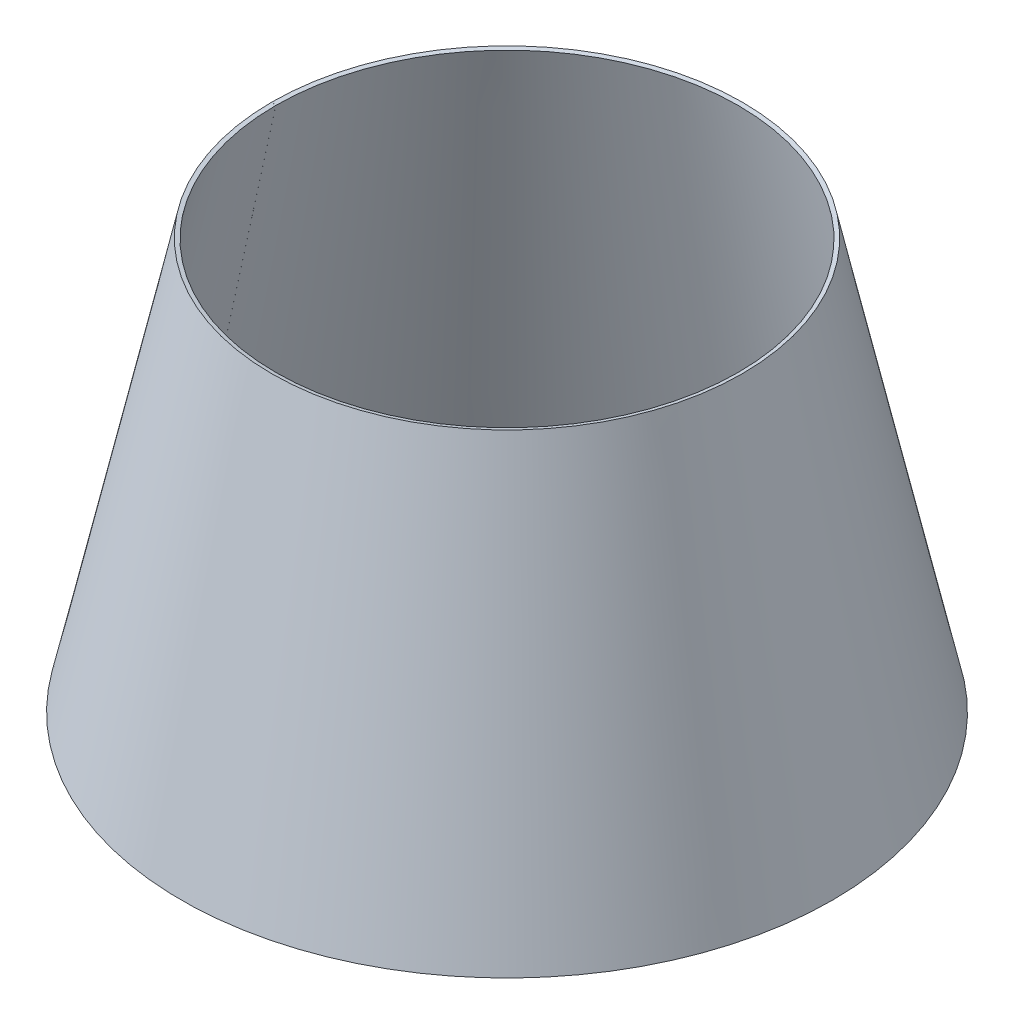
ISO-10303-21;
HEADER;
FILE_DESCRIPTION(('STEP AP214'),'2;1');
FILE_NAME('part.step','',(''),(''),'','','');
FILE_SCHEMA(('AUTOMOTIVE_DESIGN { 1 0 10303 214 1 1 1 1 }'));
ENDSEC;
DATA;
#1=APPLICATION_CONTEXT('core data for automotive mechanical design processes');
#2=APPLICATION_PROTOCOL_DEFINITION('international standard','automotive_design',2000,#1);
#3=PRODUCT_CONTEXT('',#1,'mechanical');
#4=PRODUCT('Part','Part','',(#3));
#5=PRODUCT_RELATED_PRODUCT_CATEGORY('part','',(#4));
#6=PRODUCT_DEFINITION_FORMATION('','',#4);
#7=PRODUCT_DEFINITION_CONTEXT('part definition',#1,'design');
#8=PRODUCT_DEFINITION('design','',#6,#7);
#9=PRODUCT_DEFINITION_SHAPE('','',#8);
#10=(LENGTH_UNIT() NAMED_UNIT(*) SI_UNIT(.MILLI.,.METRE.));
#11=(NAMED_UNIT(*) PLANE_ANGLE_UNIT() SI_UNIT($,.RADIAN.));
#12=(NAMED_UNIT(*) SI_UNIT($,.STERADIAN.) SOLID_ANGLE_UNIT());
#13=UNCERTAINTY_MEASURE_WITH_UNIT(LENGTH_MEASURE(1.E-05),#10,'distance_accuracy_value','');
#14=(GEOMETRIC_REPRESENTATION_CONTEXT(3) GLOBAL_UNCERTAINTY_ASSIGNED_CONTEXT((#13)) GLOBAL_UNIT_ASSIGNED_CONTEXT((#10,
#11,#12)) REPRESENTATION_CONTEXT('',''));
#15=CARTESIAN_POINT('',(0.,0.,0.));
#16=DIRECTION('',(0.,0.,1.));
#17=DIRECTION('',(1.,0.,0.));
#18=AXIS2_PLACEMENT_3D('',#15,#16,#17);
#19=CARTESIAN_POINT('',(0.,0.0927642969351279,0.));
#20=DIRECTION('',(0.,1.,0.));
#21=DIRECTION('',(0.,0.,1.));
#22=AXIS2_PLACEMENT_3D('',#19,#20,#21);
#23=CONICAL_SURFACE('',#22,34.2853179450938,1.35427689759338);
#24=CARTESIAN_POINT('',(0.,0.0927642969351279,0.));
#25=DIRECTION('',(0.,-1.,0.));
#26=DIRECTION('',(0.,0.,-1.));
#27=AXIS2_PLACEMENT_3D('',#24,#25,#26);
#28=CIRCLE('',#27,34.2853179450938);
#29=CARTESIAN_POINT('',(-34.2853174228985,0.0927642969351279,-0.00598391680149054));
#30=VERTEX_POINT('',#29);
#31=CARTESIAN_POINT('',(-34.2853179450938,0.0927642969351279,0.));
#32=VERTEX_POINT('',#31);
#33=EDGE_CURVE('E70',#30,#32,#28,.T.);
#34=ORIENTED_EDGE('',*,*,#33,.T.);
#35=DIRECTION('',(0.976651100263531,-0.214831627918315,0.));
#36=VECTOR('',#35,1.);
#37=CARTESIAN_POINT('',(-33.8636,0.,0.));
#38=LINE('',#37,#36);
#39=CARTESIAN_POINT('',(-33.8636,0.,0.));
#40=VERTEX_POINT('',#39);
#41=EDGE_CURVE('E211',#32,#40,#38,.T.);
#42=ORIENTED_EDGE('',*,*,#41,.T.);
#43=CARTESIAN_POINT('',(0.,0.,0.));
#44=DIRECTION('',(0.,-1.,0.));
#45=DIRECTION('',(0.,0.,-1.));
#46=AXIS2_PLACEMENT_3D('',#43,#44,#45);
#47=CIRCLE('',#46,33.8636);
#48=CARTESIAN_POINT('',(-33.8635994842279,0.,-0.00591031313530381));
#49=VERTEX_POINT('',#48);
#50=EDGE_CURVE('E192',#49,#40,#47,.T.);
#51=ORIENTED_EDGE('',*,*,#50,.F.);
#52=DIRECTION('',(0.976651085388285,-0.214831627918315,0.000170457772549182));
#53=VECTOR('',#52,1.);
#54=CARTESIAN_POINT('',(-33.8635994842279,0.,-0.00591031313530381));
#55=LINE('',#54,#53);
#56=EDGE_CURVE('E223',#30,#49,#55,.T.);
#57=ORIENTED_EDGE('',*,*,#56,.F.);
#58=EDGE_LOOP('',(#34,#42,#51,#57));
#59=FACE_BOUND('',#58,.T.);
#60=ADVANCED_FACE('F151',(#59),#23,.T.);
#61=CARTESIAN_POINT('',(0.,43.3427642969351,0.));
#62=DIRECTION('',(0.,-1.,0.));
#63=DIRECTION('',(0.,0.,-1.));
#64=AXIS2_PLACEMENT_3D('',#61,#62,#63);
#65=CONICAL_SURFACE('',#64,24.7717179450938,0.216519429201514);
#66=CARTESIAN_POINT('',(0.,43.3427642969351,0.));
#67=DIRECTION('',(0.,-1.,0.));
#68=DIRECTION('',(0.,0.,-1.));
#69=AXIS2_PLACEMENT_3D('',#66,#67,#68);
#70=CIRCLE('',#69,24.7717179450938);
#71=CARTESIAN_POINT('',(-24.771717567799,43.3427642969351,-0.00432348037287615));
#72=VERTEX_POINT('',#71);
#73=CARTESIAN_POINT('',(-24.7717179450938,43.3427642969351,0.));
#74=VERTEX_POINT('',#73);
#75=EDGE_CURVE('E160',#72,#74,#70,.T.);
#76=ORIENTED_EDGE('',*,*,#75,.T.);
#77=DIRECTION('',(-0.214831627918315,-0.976651100263531,0.));
#78=VECTOR('',#77,1.);
#79=CARTESIAN_POINT('',(-34.2853179450938,0.0927642969351279,0.));
#80=LINE('',#79,#78);
#81=EDGE_CURVE('E220',#74,#32,#80,.T.);
#82=ORIENTED_EDGE('',*,*,#81,.T.);
#83=ORIENTED_EDGE('',*,*,#33,.F.);
#84=DIRECTION('',(-0.214831624646242,-0.976651100263531,-3.74951922525755E-05));
#85=VECTOR('',#84,1.);
#86=CARTESIAN_POINT('',(-34.2853174228985,0.0927642969351279,-0.00598391680149054));
#87=LINE('',#86,#85);
#88=EDGE_CURVE('E205',#72,#30,#87,.T.);
#89=ORIENTED_EDGE('',*,*,#88,.F.);
#90=EDGE_LOOP('',(#76,#82,#83,#89));
#91=FACE_BOUND('',#90,.T.);
#92=ADVANCED_FACE('F153',(#91),#65,.T.);
#93=CARTESIAN_POINT('',(0.,43.25,0.));
#94=DIRECTION('',(0.,1.,0.));
#95=DIRECTION('',(0.,0.,1.));
#96=AXIS2_PLACEMENT_3D('',#93,#94,#95);
#97=CONICAL_SURFACE('',#96,24.35,1.35427689759336);
#98=CARTESIAN_POINT('',(0.,43.25,0.));
#99=DIRECTION('',(0.,-1.,0.));
#100=DIRECTION('',(0.,0.,-1.));
#101=AXIS2_PLACEMENT_3D('',#98,#99,#100);
#102=CIRCLE('',#101,24.35);
#103=CARTESIAN_POINT('',(-24.3499996291283,43.25,-0.00424987670668942));
#104=VERTEX_POINT('',#103);
#105=CARTESIAN_POINT('',(-24.35,43.25,0.));
#106=VERTEX_POINT('',#105);
#107=EDGE_CURVE('E204',#104,#106,#102,.T.);
#108=ORIENTED_EDGE('',*,*,#107,.T.);
#109=DIRECTION('',(-0.976651100263527,0.214831627918335,0.));
#110=VECTOR('',#109,1.);
#111=CARTESIAN_POINT('',(-24.35,43.25,0.));
#112=LINE('',#111,#110);
#113=EDGE_CURVE('E212',#106,#74,#112,.T.);
#114=ORIENTED_EDGE('',*,*,#113,.T.);
#115=ORIENTED_EDGE('',*,*,#75,.F.);
#116=DIRECTION('',(-0.97665108538828,0.214831627918335,-0.000170457772549181));
#117=VECTOR('',#116,1.);
#118=CARTESIAN_POINT('',(-24.3499996291283,43.25,-0.00424987670668942));
#119=LINE('',#118,#117);
#120=EDGE_CURVE('E228',#104,#72,#119,.T.);
#121=ORIENTED_EDGE('',*,*,#120,.F.);
#122=EDGE_LOOP('',(#108,#114,#115,#121));
#123=FACE_BOUND('',#122,.T.);
#124=ADVANCED_FACE('F235',(#123),#97,.F.);
#125=CARTESIAN_POINT('',(0.,0.,0.));
#126=DIRECTION('',(0.,-1.,0.));
#127=DIRECTION('',(0.,0.,-1.));
#128=AXIS2_PLACEMENT_3D('',#125,#126,#127);
#129=CONICAL_SURFACE('',#128,33.8636,0.216519429201514);
#130=DIRECTION('',(0.214831624646242,0.976651100263531,3.74951922525756E-05));
#131=VECTOR('',#130,1.);
#132=CARTESIAN_POINT('',(-33.8635994842279,0.,-0.00591031313530381));
#133=LINE('',#132,#131);
#134=EDGE_CURVE('E198',#49,#104,#133,.T.);
#135=ORIENTED_EDGE('',*,*,#134,.F.);
#136=ORIENTED_EDGE('',*,*,#50,.T.);
#137=DIRECTION('',(0.214831627918315,0.976651100263531,0.));
#138=VECTOR('',#137,1.);
#139=CARTESIAN_POINT('',(-33.8636,0.,0.));
#140=LINE('',#139,#138);
#141=EDGE_CURVE('E195',#40,#106,#140,.T.);
#142=ORIENTED_EDGE('',*,*,#141,.T.);
#143=ORIENTED_EDGE('',*,*,#107,.F.);
#144=EDGE_LOOP('',(#135,#136,#142,#143));
#145=FACE_BOUND('',#144,.T.);
#146=ADVANCED_FACE('F194',(#145),#129,.F.);
#147=CARTESIAN_POINT('',(0.,0.,0.));
#148=DIRECTION('',(0.00017453292429936,0.,-0.999999984769129));
#149=DIRECTION('',(-0.999999984769129,0.,-0.00017453292429936));
#150=AXIS2_PLACEMENT_3D('',#147,#148,#149);
#151=PLANE('',#150);
#152=ORIENTED_EDGE('',*,*,#56,.T.);
#153=ORIENTED_EDGE('',*,*,#134,.T.);
#154=ORIENTED_EDGE('',*,*,#120,.T.);
#155=ORIENTED_EDGE('',*,*,#88,.T.);
#156=EDGE_LOOP('',(#152,#153,#154,#155));
#157=FACE_BOUND('',#156,.T.);
#158=ADVANCED_FACE('F237',(#157),#151,.F.);
#159=CARTESIAN_POINT('',(0.,0.,0.));
#160=DIRECTION('',(0.,0.,-1.));
#161=DIRECTION('',(-1.,0.,0.));
#162=AXIS2_PLACEMENT_3D('',#159,#160,#161);
#163=PLANE('',#162);
#164=ORIENTED_EDGE('',*,*,#41,.F.);
#165=ORIENTED_EDGE('',*,*,#81,.F.);
#166=ORIENTED_EDGE('',*,*,#113,.F.);
#167=ORIENTED_EDGE('',*,*,#141,.F.);
#168=EDGE_LOOP('',(#164,#165,#166,#167));
#169=FACE_BOUND('',#168,.T.);
#170=ADVANCED_FACE('F209',(#169),#163,.T.);
#171=CLOSED_SHELL('',(#60,#92,#124,#146,#158,#170));
#172=MANIFOLD_SOLID_BREP('B10',#171);
#173=ADVANCED_BREP_SHAPE_REPRESENTATION('',(#18,#172),#14);
#174=SHAPE_DEFINITION_REPRESENTATION(#9,#173);
ENDSEC;
END-ISO-10303-21;
